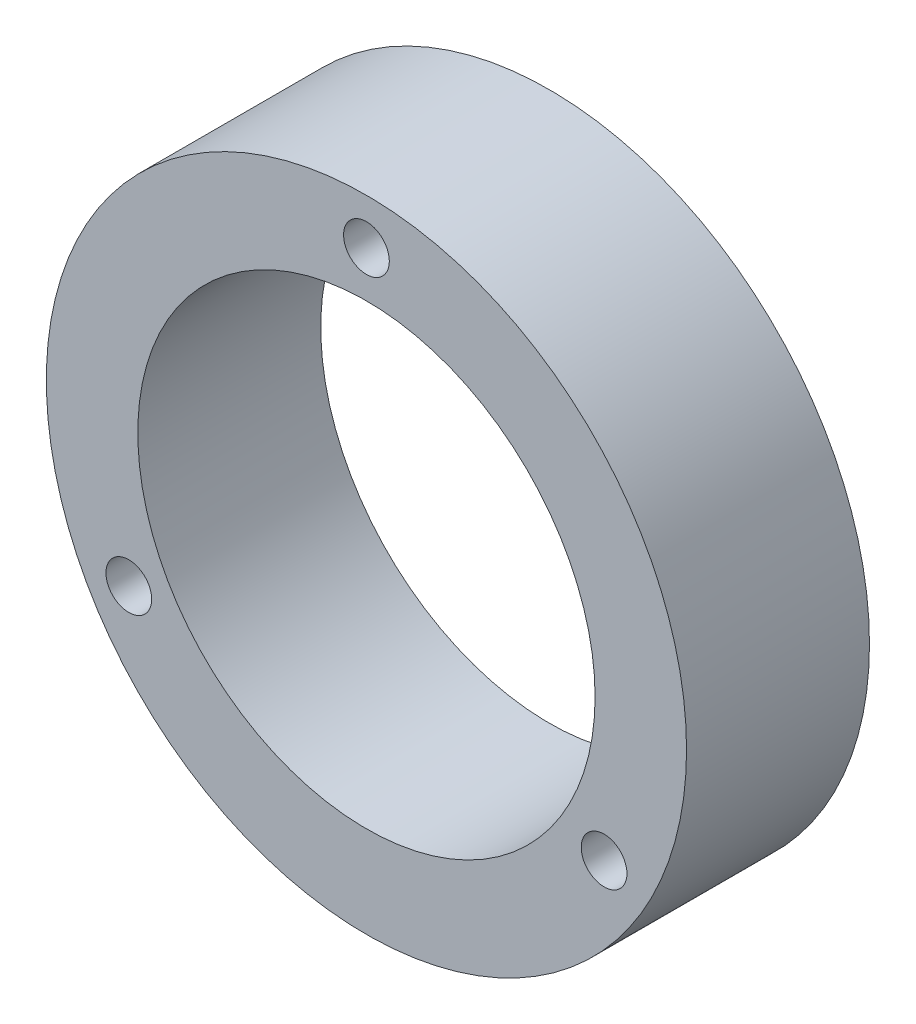
ISO-10303-21;
HEADER;
FILE_DESCRIPTION(('STEP AP214'),'2;1');
FILE_NAME('part.step','',(''),(''),'','','');
FILE_SCHEMA(('AUTOMOTIVE_DESIGN { 1 0 10303 214 1 1 1 1 }'));
ENDSEC;
DATA;
#1=APPLICATION_CONTEXT('core data for automotive mechanical design processes');
#2=APPLICATION_PROTOCOL_DEFINITION('international standard','automotive_design',2000,#1);
#3=PRODUCT_CONTEXT('',#1,'mechanical');
#4=PRODUCT('Part','Part','',(#3));
#5=PRODUCT_RELATED_PRODUCT_CATEGORY('part','',(#4));
#6=PRODUCT_DEFINITION_FORMATION('','',#4);
#7=PRODUCT_DEFINITION_CONTEXT('part definition',#1,'design');
#8=PRODUCT_DEFINITION('design','',#6,#7);
#9=PRODUCT_DEFINITION_SHAPE('','',#8);
#10=(LENGTH_UNIT() NAMED_UNIT(*) SI_UNIT(.MILLI.,.METRE.));
#11=(NAMED_UNIT(*) PLANE_ANGLE_UNIT() SI_UNIT($,.RADIAN.));
#12=(NAMED_UNIT(*) SI_UNIT($,.STERADIAN.) SOLID_ANGLE_UNIT());
#13=UNCERTAINTY_MEASURE_WITH_UNIT(LENGTH_MEASURE(1.E-05),#10,'distance_accuracy_value','');
#14=(GEOMETRIC_REPRESENTATION_CONTEXT(3) GLOBAL_UNCERTAINTY_ASSIGNED_CONTEXT((#13)) GLOBAL_UNIT_ASSIGNED_CONTEXT((#10,
#11,#12)) REPRESENTATION_CONTEXT('',''));
#15=CARTESIAN_POINT('',(0.,0.,0.));
#16=DIRECTION('',(0.,0.,1.));
#17=DIRECTION('',(1.,0.,0.));
#18=AXIS2_PLACEMENT_3D('',#15,#16,#17);
#19=CARTESIAN_POINT('',(0.,0.,16.25));
#20=DIRECTION('',(0.,0.,1.));
#21=DIRECTION('',(1.,0.,0.));
#22=AXIS2_PLACEMENT_3D('',#19,#20,#21);
#23=CYLINDRICAL_SURFACE('',#22,3.49999999999989);
#24=CARTESIAN_POINT('',(0.,0.,16.25));
#25=DIRECTION('',(0.,0.,1.));
#26=DIRECTION('',(1.,0.,0.));
#27=AXIS2_PLACEMENT_3D('',#24,#25,#26);
#28=CIRCLE('',#27,3.49999999999989);
#29=CARTESIAN_POINT('',(3.49999999999989,0.,16.25));
#30=VERTEX_POINT('',#29);
#31=EDGE_CURVE('E10',#30,#30,#28,.T.);
#32=ORIENTED_EDGE('',*,*,#31,.T.);
#33=EDGE_LOOP('',(#32));
#34=FACE_BOUND('',#33,.T.);
#35=CARTESIAN_POINT('',(0.,0.,18.25));
#36=DIRECTION('',(0.,0.,1.));
#37=DIRECTION('',(1.,0.,0.));
#38=AXIS2_PLACEMENT_3D('',#35,#36,#37);
#39=CIRCLE('',#38,3.49999999999989);
#40=CARTESIAN_POINT('',(3.49999999999989,0.,18.25));
#41=VERTEX_POINT('',#40);
#42=EDGE_CURVE('E42',#41,#41,#39,.T.);
#43=ORIENTED_EDGE('',*,*,#42,.F.);
#44=EDGE_LOOP('',(#43));
#45=FACE_BOUND('',#44,.T.);
#46=ADVANCED_FACE('F39',(#34,#45),#23,.T.);
#47=CARTESIAN_POINT('',(0.,0.,16.25));
#48=DIRECTION('',(0.,0.,1.));
#49=DIRECTION('',(1.,0.,0.));
#50=AXIS2_PLACEMENT_3D('',#47,#48,#49);
#51=PLANE('',#50);
#52=CARTESIAN_POINT('',(0.,2.99999999999988,16.25));
#53=DIRECTION('',(0.,0.,1.));
#54=DIRECTION('',(1.,0.,0.));
#55=AXIS2_PLACEMENT_3D('',#52,#53,#54);
#56=CIRCLE('',#55,0.25);
#57=CARTESIAN_POINT('',(0.25,2.99999999999988,16.25));
#58=VERTEX_POINT('',#57);
#59=EDGE_CURVE('E54',#58,#58,#56,.T.);
#60=ORIENTED_EDGE('',*,*,#59,.T.);
#61=EDGE_LOOP('',(#60));
#62=FACE_BOUND('',#61,.T.);
#63=CARTESIAN_POINT('',(2.5980762113534,-1.49999999999983,16.25));
#64=DIRECTION('',(0.,0.,1.));
#65=DIRECTION('',(1.,0.,0.));
#66=AXIS2_PLACEMENT_3D('',#63,#64,#65);
#67=CIRCLE('',#66,0.250000000000165);
#68=CARTESIAN_POINT('',(2.84807621135357,-1.49999999999983,16.25));
#69=VERTEX_POINT('',#68);
#70=EDGE_CURVE('E63',#69,#69,#67,.T.);
#71=ORIENTED_EDGE('',*,*,#70,.T.);
#72=EDGE_LOOP('',(#71));
#73=FACE_BOUND('',#72,.T.);
#74=CARTESIAN_POINT('',(-2.59807621135302,-1.50000000000005,16.25));
#75=DIRECTION('',(0.,0.,1.));
#76=DIRECTION('',(1.,0.,0.));
#77=AXIS2_PLACEMENT_3D('',#74,#75,#76);
#78=CIRCLE('',#77,0.25000000000024);
#79=CARTESIAN_POINT('',(-2.34807621135278,-1.50000000000005,16.25));
#80=VERTEX_POINT('',#79);
#81=EDGE_CURVE('E57',#80,#80,#78,.T.);
#82=ORIENTED_EDGE('',*,*,#81,.T.);
#83=EDGE_LOOP('',(#82));
#84=FACE_BOUND('',#83,.T.);
#85=CARTESIAN_POINT('',(0.,0.,16.25));
#86=DIRECTION('',(0.,0.,1.));
#87=DIRECTION('',(1.,0.,0.));
#88=AXIS2_PLACEMENT_3D('',#85,#86,#87);
#89=CIRCLE('',#88,2.49999999999988);
#90=CARTESIAN_POINT('',(2.49999999999988,0.,16.25));
#91=VERTEX_POINT('',#90);
#92=EDGE_CURVE('E49',#91,#91,#89,.T.);
#93=ORIENTED_EDGE('',*,*,#92,.T.);
#94=EDGE_LOOP('',(#93));
#95=FACE_BOUND('',#94,.T.);
#96=ORIENTED_EDGE('',*,*,#31,.F.);
#97=EDGE_LOOP('',(#96));
#98=FACE_BOUND('',#97,.T.);
#99=ADVANCED_FACE('F75',(#62,#73,#84,#95,#98),#51,.F.);
#100=CARTESIAN_POINT('',(0.,0.,18.25));
#101=DIRECTION('',(0.,0.,1.));
#102=DIRECTION('',(1.,0.,0.));
#103=AXIS2_PLACEMENT_3D('',#100,#101,#102);
#104=PLANE('',#103);
#105=CARTESIAN_POINT('',(0.,2.99999999999988,18.25));
#106=DIRECTION('',(0.,0.,1.));
#107=DIRECTION('',(1.,0.,0.));
#108=AXIS2_PLACEMENT_3D('',#105,#106,#107);
#109=CIRCLE('',#108,0.25);
#110=CARTESIAN_POINT('',(0.25,2.99999999999988,18.25));
#111=VERTEX_POINT('',#110);
#112=EDGE_CURVE('E69',#111,#111,#109,.T.);
#113=ORIENTED_EDGE('',*,*,#112,.F.);
#114=EDGE_LOOP('',(#113));
#115=FACE_BOUND('',#114,.T.);
#116=CARTESIAN_POINT('',(2.5980762113534,-1.49999999999983,18.25));
#117=DIRECTION('',(0.,0.,1.));
#118=DIRECTION('',(1.,0.,0.));
#119=AXIS2_PLACEMENT_3D('',#116,#117,#118);
#120=CIRCLE('',#119,0.250000000000165);
#121=CARTESIAN_POINT('',(2.84807621135357,-1.49999999999983,18.25));
#122=VERTEX_POINT('',#121);
#123=EDGE_CURVE('E66',#122,#122,#120,.T.);
#124=ORIENTED_EDGE('',*,*,#123,.F.);
#125=EDGE_LOOP('',(#124));
#126=FACE_BOUND('',#125,.T.);
#127=CARTESIAN_POINT('',(-2.59807621135302,-1.50000000000005,18.25));
#128=DIRECTION('',(0.,0.,1.));
#129=DIRECTION('',(1.,0.,0.));
#130=AXIS2_PLACEMENT_3D('',#127,#128,#129);
#131=CIRCLE('',#130,0.25000000000024);
#132=CARTESIAN_POINT('',(-2.34807621135278,-1.50000000000005,18.25));
#133=VERTEX_POINT('',#132);
#134=EDGE_CURVE('E60',#133,#133,#131,.T.);
#135=ORIENTED_EDGE('',*,*,#134,.F.);
#136=EDGE_LOOP('',(#135));
#137=FACE_BOUND('',#136,.T.);
#138=CARTESIAN_POINT('',(0.,0.,18.25));
#139=DIRECTION('',(0.,0.,1.));
#140=DIRECTION('',(1.,0.,0.));
#141=AXIS2_PLACEMENT_3D('',#138,#139,#140);
#142=CIRCLE('',#141,2.49999999999988);
#143=CARTESIAN_POINT('',(2.49999999999988,0.,18.25));
#144=VERTEX_POINT('',#143);
#145=EDGE_CURVE('E51',#144,#144,#142,.T.);
#146=ORIENTED_EDGE('',*,*,#145,.F.);
#147=EDGE_LOOP('',(#146));
#148=FACE_BOUND('',#147,.T.);
#149=ORIENTED_EDGE('',*,*,#42,.T.);
#150=EDGE_LOOP('',(#149));
#151=FACE_BOUND('',#150,.T.);
#152=ADVANCED_FACE('F85',(#115,#126,#137,#148,#151),#104,.T.);
#153=CARTESIAN_POINT('',(0.,0.,16.25));
#154=DIRECTION('',(0.,0.,1.));
#155=DIRECTION('',(1.,0.,0.));
#156=AXIS2_PLACEMENT_3D('',#153,#154,#155);
#157=CYLINDRICAL_SURFACE('',#156,2.49999999999988);
#158=ORIENTED_EDGE('',*,*,#92,.F.);
#159=EDGE_LOOP('',(#158));
#160=FACE_BOUND('',#159,.T.);
#161=ORIENTED_EDGE('',*,*,#145,.T.);
#162=EDGE_LOOP('',(#161));
#163=FACE_BOUND('',#162,.T.);
#164=ADVANCED_FACE('F88',(#160,#163),#157,.F.);
#165=CARTESIAN_POINT('',(-2.59807621135302,-1.50000000000005,16.25));
#166=DIRECTION('',(0.,0.,1.));
#167=DIRECTION('',(1.,0.,0.));
#168=AXIS2_PLACEMENT_3D('',#165,#166,#167);
#169=CYLINDRICAL_SURFACE('',#168,0.25000000000024);
#170=ORIENTED_EDGE('',*,*,#81,.F.);
#171=EDGE_LOOP('',(#170));
#172=FACE_BOUND('',#171,.T.);
#173=ORIENTED_EDGE('',*,*,#134,.T.);
#174=EDGE_LOOP('',(#173));
#175=FACE_BOUND('',#174,.T.);
#176=ADVANCED_FACE('F108',(#172,#175),#169,.F.);
#177=CARTESIAN_POINT('',(2.5980762113534,-1.49999999999983,16.25));
#178=DIRECTION('',(0.,0.,1.));
#179=DIRECTION('',(1.,0.,0.));
#180=AXIS2_PLACEMENT_3D('',#177,#178,#179);
#181=CYLINDRICAL_SURFACE('',#180,0.250000000000165);
#182=ORIENTED_EDGE('',*,*,#70,.F.);
#183=EDGE_LOOP('',(#182));
#184=FACE_BOUND('',#183,.T.);
#185=ORIENTED_EDGE('',*,*,#123,.T.);
#186=EDGE_LOOP('',(#185));
#187=FACE_BOUND('',#186,.T.);
#188=ADVANCED_FACE('F81',(#184,#187),#181,.F.);
#189=CARTESIAN_POINT('',(0.,2.99999999999988,16.25));
#190=DIRECTION('',(0.,0.,1.));
#191=DIRECTION('',(1.,0.,0.));
#192=AXIS2_PLACEMENT_3D('',#189,#190,#191);
#193=CYLINDRICAL_SURFACE('',#192,0.25);
#194=ORIENTED_EDGE('',*,*,#59,.F.);
#195=EDGE_LOOP('',(#194));
#196=FACE_BOUND('',#195,.T.);
#197=ORIENTED_EDGE('',*,*,#112,.T.);
#198=EDGE_LOOP('',(#197));
#199=FACE_BOUND('',#198,.T.);
#200=ADVANCED_FACE('F78',(#196,#199),#193,.F.);
#201=CLOSED_SHELL('',(#46,#99,#152,#164,#176,#188,#200));
#202=MANIFOLD_SOLID_BREP('B2',#201);
#203=ADVANCED_BREP_SHAPE_REPRESENTATION('',(#18,#202),#14);
#204=SHAPE_DEFINITION_REPRESENTATION(#9,#203);
ENDSEC;
END-ISO-10303-21;
